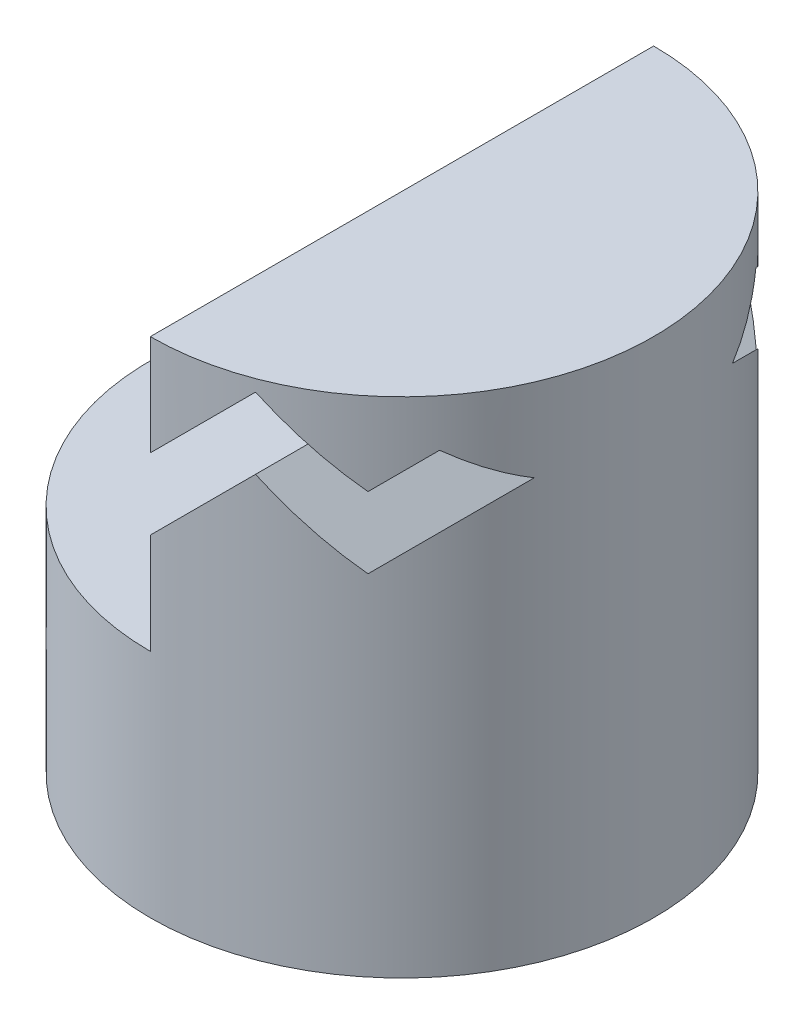
ISO-10303-21;
HEADER;
FILE_DESCRIPTION(('STEP AP214'),'2;1');
FILE_NAME('part.step','',(''),(''),'','','');
FILE_SCHEMA(('AUTOMOTIVE_DESIGN { 1 0 10303 214 1 1 1 1 }'));
ENDSEC;
DATA;
#1=APPLICATION_CONTEXT('core data for automotive mechanical design processes');
#2=APPLICATION_PROTOCOL_DEFINITION('international standard','automotive_design',2000,#1);
#3=PRODUCT_CONTEXT('',#1,'mechanical');
#4=PRODUCT('Part','Part','',(#3));
#5=PRODUCT_RELATED_PRODUCT_CATEGORY('part','',(#4));
#6=PRODUCT_DEFINITION_FORMATION('','',#4);
#7=PRODUCT_DEFINITION_CONTEXT('part definition',#1,'design');
#8=PRODUCT_DEFINITION('design','',#6,#7);
#9=PRODUCT_DEFINITION_SHAPE('','',#8);
#10=(LENGTH_UNIT() NAMED_UNIT(*) SI_UNIT(.MILLI.,.METRE.));
#11=(NAMED_UNIT(*) PLANE_ANGLE_UNIT() SI_UNIT($,.RADIAN.));
#12=(NAMED_UNIT(*) SI_UNIT($,.STERADIAN.) SOLID_ANGLE_UNIT());
#13=UNCERTAINTY_MEASURE_WITH_UNIT(LENGTH_MEASURE(1.E-05),#10,'distance_accuracy_value','');
#14=(GEOMETRIC_REPRESENTATION_CONTEXT(3) GLOBAL_UNCERTAINTY_ASSIGNED_CONTEXT((#13)) GLOBAL_UNIT_ASSIGNED_CONTEXT((#10,
#11,#12)) REPRESENTATION_CONTEXT('',''));
#15=CARTESIAN_POINT('',(0.,0.,0.));
#16=DIRECTION('',(0.,0.,1.));
#17=DIRECTION('',(1.,0.,0.));
#18=AXIS2_PLACEMENT_3D('',#15,#16,#17);
#19=CARTESIAN_POINT('',(0.,100.,0.));
#20=DIRECTION('',(0.,-1.,0.));
#21=DIRECTION('',(0.,0.,-1.));
#22=AXIS2_PLACEMENT_3D('',#19,#20,#21);
#23=CYLINDRICAL_SURFACE('',#22,50.);
#24=CARTESIAN_POINT('',(0.,0.,0.));
#25=DIRECTION('',(0.,1.,0.));
#26=DIRECTION('',(0.,0.,1.));
#27=AXIS2_PLACEMENT_3D('',#24,#25,#26);
#28=CIRCLE('',#27,50.);
#29=CARTESIAN_POINT('',(0.,0.,50.));
#30=VERTEX_POINT('',#29);
#31=EDGE_CURVE('E156',#30,#30,#28,.T.);
#32=ORIENTED_EDGE('',*,*,#31,.T.);
#33=EDGE_LOOP('',(#32));
#34=FACE_BOUND('',#33,.T.);
#35=DIRECTION('',(0.,1.,0.));
#36=VECTOR('',#35,1.);
#37=CARTESIAN_POINT('',(0.,65.857864376269,-50.));
#38=LINE('',#37,#36);
#39=CARTESIAN_POINT('',(0.,45.857864376269,-50.));
#40=VERTEX_POINT('',#39);
#41=CARTESIAN_POINT('',(0.,65.857864376269,-50.));
#42=VERTEX_POINT('',#41);
#43=EDGE_CURVE('E137',#40,#42,#38,.T.);
#44=ORIENTED_EDGE('',*,*,#43,.T.);
#45=CARTESIAN_POINT('',(0.,65.857864376269,0.));
#46=DIRECTION('',(0.707106781186552,-0.707106781186543,0.));
#47=DIRECTION('',(-0.707106781186543,-0.707106781186552,0.));
#48=AXIS2_PLACEMENT_3D('',#45,#46,#47);
#49=ELLIPSE('',#48,70.7106781186552,50.);
#50=CARTESIAN_POINT('',(17.6776695296638,83.535533905933,-46.7707173346742));
#51=VERTEX_POINT('',#50);
#52=EDGE_CURVE('E11',#42,#51,#49,.T.);
#53=ORIENTED_EDGE('',*,*,#52,.T.);
#54=CARTESIAN_POINT('',(0.,101.213203435597,0.));
#55=DIRECTION('',(-0.707106781186548,-0.707106781186547,0.));
#56=DIRECTION('',(0.707106781186547,-0.707106781186548,0.));
#57=AXIS2_PLACEMENT_3D('',#54,#55,#56);
#58=ELLIPSE('',#57,70.7106781186548,50.);
#59=CARTESIAN_POINT('',(31.8198051533948,69.3933982822019,-38.5681215513537));
#60=VERTEX_POINT('',#59);
#61=EDGE_CURVE('E48',#51,#60,#58,.T.);
#62=ORIENTED_EDGE('',*,*,#61,.T.);
#63=CARTESIAN_POINT('',(0.,37.5735931288072,0.));
#64=DIRECTION('',(0.707106781186547,-0.707106781186547,0.));
#65=DIRECTION('',(-0.707106781186548,-0.707106781186548,0.));
#66=AXIS2_PLACEMENT_3D('',#63,#64,#65);
#67=ELLIPSE('',#66,70.7106781186548,50.);
#68=CARTESIAN_POINT('',(45.9619407771258,83.5355339059329,-19.6850196850292));
#69=VERTEX_POINT('',#68);
#70=EDGE_CURVE('E211',#60,#69,#67,.T.);
#71=ORIENTED_EDGE('',*,*,#70,.T.);
#72=CARTESIAN_POINT('',(0.,129.497474683059,0.));
#73=DIRECTION('',(0.707106781186547,0.707106781186548,0.));
#74=DIRECTION('',(0.707106781186548,-0.707106781186547,0.));
#75=AXIS2_PLACEMENT_3D('',#72,#73,#74);
#76=ELLIPSE('',#75,70.7106781186547,50.);
#77=CARTESIAN_POINT('',(38.8908729652603,90.6066017177984,-31.4245127249411));
#78=VERTEX_POINT('',#77);
#79=EDGE_CURVE('E207',#69,#78,#76,.T.);
#80=ORIENTED_EDGE('',*,*,#79,.T.);
#81=CARTESIAN_POINT('',(0.,51.7157287525381,0.));
#82=DIRECTION('',(-0.707106781186547,0.707106781186548,0.));
#83=DIRECTION('',(-0.707106781186548,-0.707106781186547,0.));
#84=AXIS2_PLACEMENT_3D('',#81,#82,#83);
#85=ELLIPSE('',#84,70.7106781186547,50.);
#86=CARTESIAN_POINT('',(31.8198051533948,83.5355339059329,-38.5681215513537));
#87=VERTEX_POINT('',#86);
#88=EDGE_CURVE('E202',#78,#87,#85,.T.);
#89=ORIENTED_EDGE('',*,*,#88,.T.);
#90=CARTESIAN_POINT('',(0.,115.355339059328,0.));
#91=DIRECTION('',(0.707106781186547,0.707106781186548,0.));
#92=DIRECTION('',(0.707106781186548,-0.707106781186547,0.));
#93=AXIS2_PLACEMENT_3D('',#90,#91,#92);
#94=ELLIPSE('',#93,70.7106781186547,50.);
#95=CARTESIAN_POINT('',(17.6776695296638,97.6776695296638,-46.7707173346742));
#96=VERTEX_POINT('',#95);
#97=EDGE_CURVE('E197',#87,#96,#94,.T.);
#98=ORIENTED_EDGE('',*,*,#97,.T.);
#99=CARTESIAN_POINT('',(0.,80.,0.));
#100=DIRECTION('',(-0.707106781186547,0.707106781186548,0.));
#101=DIRECTION('',(-0.707106781186548,-0.707106781186547,0.));
#102=AXIS2_PLACEMENT_3D('',#99,#100,#101);
#103=ELLIPSE('',#102,70.7106781186547,50.);
#104=CARTESIAN_POINT('',(0.,80.,-50.));
#105=VERTEX_POINT('',#104);
#106=EDGE_CURVE('E193',#96,#105,#103,.T.);
#107=ORIENTED_EDGE('',*,*,#106,.T.);
#108=DIRECTION('',(0.,1.,0.));
#109=VECTOR('',#108,1.);
#110=CARTESIAN_POINT('',(0.,100.,-50.));
#111=LINE('',#110,#109);
#112=CARTESIAN_POINT('',(0.,100.,-50.));
#113=VERTEX_POINT('',#112);
#114=EDGE_CURVE('E140',#105,#113,#111,.T.);
#115=ORIENTED_EDGE('',*,*,#114,.T.);
#116=CARTESIAN_POINT('',(0.,100.,0.));
#117=DIRECTION('',(0.,1.,0.));
#118=DIRECTION('',(0.,0.,1.));
#119=AXIS2_PLACEMENT_3D('',#116,#117,#118);
#120=CIRCLE('',#119,50.);
#121=CARTESIAN_POINT('',(0.,100.,50.));
#122=VERTEX_POINT('',#121);
#123=EDGE_CURVE('E129',#122,#113,#120,.T.);
#124=ORIENTED_EDGE('',*,*,#123,.F.);
#125=DIRECTION('',(0.,1.,0.));
#126=VECTOR('',#125,1.);
#127=CARTESIAN_POINT('',(0.,100.,50.));
#128=LINE('',#127,#126);
#129=CARTESIAN_POINT('',(0.,80.,50.));
#130=VERTEX_POINT('',#129);
#131=EDGE_CURVE('E55',#130,#122,#128,.T.);
#132=ORIENTED_EDGE('',*,*,#131,.F.);
#133=CARTESIAN_POINT('',(17.6776695296638,97.6776695296638,46.7707173346742));
#134=VERTEX_POINT('',#133);
#135=EDGE_CURVE('E128',#130,#134,#103,.T.);
#136=ORIENTED_EDGE('',*,*,#135,.T.);
#137=CARTESIAN_POINT('',(31.8198051533948,83.5355339059329,38.5681215513536));
#138=VERTEX_POINT('',#137);
#139=EDGE_CURVE('E63',#134,#138,#94,.T.);
#140=ORIENTED_EDGE('',*,*,#139,.T.);
#141=CARTESIAN_POINT('',(38.8908729652603,90.6066017177984,31.4245127249411));
#142=VERTEX_POINT('',#141);
#143=EDGE_CURVE('E196',#138,#142,#85,.T.);
#144=ORIENTED_EDGE('',*,*,#143,.T.);
#145=CARTESIAN_POINT('',(45.9619407771258,83.5355339059329,19.6850196850291));
#146=VERTEX_POINT('',#145);
#147=EDGE_CURVE('E201',#142,#146,#76,.T.);
#148=ORIENTED_EDGE('',*,*,#147,.T.);
#149=CARTESIAN_POINT('',(31.8198051533948,69.3933982822019,38.5681215513537));
#150=VERTEX_POINT('',#149);
#151=EDGE_CURVE('E206',#146,#150,#67,.T.);
#152=ORIENTED_EDGE('',*,*,#151,.T.);
#153=CARTESIAN_POINT('',(17.6776695296638,83.535533905933,46.7707173346742));
#154=VERTEX_POINT('',#153);
#155=EDGE_CURVE('E210',#150,#154,#58,.T.);
#156=ORIENTED_EDGE('',*,*,#155,.T.);
#157=CARTESIAN_POINT('',(0.,65.857864376269,50.));
#158=VERTEX_POINT('',#157);
#159=EDGE_CURVE('E42',#154,#158,#49,.T.);
#160=ORIENTED_EDGE('',*,*,#159,.T.);
#161=DIRECTION('',(0.,1.,0.));
#162=VECTOR('',#161,1.);
#163=CARTESIAN_POINT('',(0.,65.857864376269,50.));
#164=LINE('',#163,#162);
#165=CARTESIAN_POINT('',(0.,45.857864376269,50.));
#166=VERTEX_POINT('',#165);
#167=EDGE_CURVE('E135',#166,#158,#164,.T.);
#168=ORIENTED_EDGE('',*,*,#167,.F.);
#169=CARTESIAN_POINT('',(0.,45.857864376269,0.));
#170=DIRECTION('',(0.,-1.,0.));
#171=DIRECTION('',(1.,0.,0.));
#172=AXIS2_PLACEMENT_3D('',#169,#170,#171);
#173=CIRCLE('',#172,50.);
#174=EDGE_CURVE('E119',#166,#40,#173,.T.);
#175=ORIENTED_EDGE('',*,*,#174,.T.);
#176=EDGE_LOOP('',(#44,#53,#62,#71,#80,#89,#98,#107,#115,#124,#132,#136,#140,#144,#148,#152,
#156,#160,#168,#175));
#177=FACE_BOUND('',#176,.T.);
#178=ADVANCED_FACE('F39',(#34,#177),#23,.T.);
#179=CARTESIAN_POINT('',(0.,100.,0.));
#180=DIRECTION('',(0.,1.,0.));
#181=DIRECTION('',(0.,0.,1.));
#182=AXIS2_PLACEMENT_3D('',#179,#180,#181);
#183=PLANE('',#182);
#184=DIRECTION('',(0.,0.,1.));
#185=VECTOR('',#184,1.);
#186=CARTESIAN_POINT('',(0.,100.,-50.));
#187=LINE('',#186,#185);
#188=EDGE_CURVE('E153',#113,#122,#187,.T.);
#189=ORIENTED_EDGE('',*,*,#188,.T.);
#190=ORIENTED_EDGE('',*,*,#123,.T.);
#191=EDGE_LOOP('',(#189,#190));
#192=FACE_BOUND('',#191,.T.);
#193=ADVANCED_FACE('F237',(#192),#183,.T.);
#194=CARTESIAN_POINT('',(0.,0.,0.));
#195=DIRECTION('',(0.,1.,0.));
#196=DIRECTION('',(0.,0.,1.));
#197=AXIS2_PLACEMENT_3D('',#194,#195,#196);
#198=PLANE('',#197);
#199=ORIENTED_EDGE('',*,*,#31,.F.);
#200=EDGE_LOOP('',(#199));
#201=FACE_BOUND('',#200,.T.);
#202=ADVANCED_FACE('F239',(#201),#198,.F.);
#203=CARTESIAN_POINT('',(0.,80.,-50.));
#204=DIRECTION('',(-0.707106781186547,0.707106781186548,0.));
#205=DIRECTION('',(-0.707106781186548,-0.707106781186547,0.));
#206=AXIS2_PLACEMENT_3D('',#203,#204,#205);
#207=PLANE('',#206);
#208=DIRECTION('',(0.,0.,1.));
#209=VECTOR('',#208,1.);
#210=CARTESIAN_POINT('',(0.,80.,-50.));
#211=LINE('',#210,#209);
#212=EDGE_CURVE('E157',#105,#130,#211,.T.);
#213=ORIENTED_EDGE('',*,*,#212,.F.);
#214=ORIENTED_EDGE('',*,*,#106,.F.);
#215=DIRECTION('',(0.,0.,1.));
#216=VECTOR('',#215,1.);
#217=CARTESIAN_POINT('',(17.6776695296638,97.6776695296638,-50.));
#218=LINE('',#217,#216);
#219=EDGE_CURVE('E160',#96,#134,#218,.T.);
#220=ORIENTED_EDGE('',*,*,#219,.T.);
#221=ORIENTED_EDGE('',*,*,#135,.F.);
#222=EDGE_LOOP('',(#213,#214,#220,#221));
#223=FACE_BOUND('',#222,.T.);
#224=ADVANCED_FACE('F229',(#223),#207,.F.);
#225=CARTESIAN_POINT('',(31.8198051533948,83.5355339059329,-50.));
#226=DIRECTION('',(0.707106781186547,0.707106781186548,0.));
#227=DIRECTION('',(-0.707106781186548,0.707106781186547,0.));
#228=AXIS2_PLACEMENT_3D('',#225,#226,#227);
#229=PLANE('',#228);
#230=DIRECTION('',(0.,0.,1.));
#231=VECTOR('',#230,1.);
#232=CARTESIAN_POINT('',(31.8198051533948,83.5355339059329,-50.));
#233=LINE('',#232,#231);
#234=EDGE_CURVE('E163',#87,#138,#233,.T.);
#235=ORIENTED_EDGE('',*,*,#234,.T.);
#236=ORIENTED_EDGE('',*,*,#139,.F.);
#237=ORIENTED_EDGE('',*,*,#219,.F.);
#238=ORIENTED_EDGE('',*,*,#97,.F.);
#239=EDGE_LOOP('',(#235,#236,#237,#238));
#240=FACE_BOUND('',#239,.T.);
#241=ADVANCED_FACE('F230',(#240),#229,.F.);
#242=CARTESIAN_POINT('',(38.8908729652603,90.6066017177984,-50.));
#243=DIRECTION('',(-0.707106781186547,0.707106781186548,0.));
#244=DIRECTION('',(-0.707106781186548,-0.707106781186547,0.));
#245=AXIS2_PLACEMENT_3D('',#242,#243,#244);
#246=PLANE('',#245);
#247=ORIENTED_EDGE('',*,*,#234,.F.);
#248=ORIENTED_EDGE('',*,*,#88,.F.);
#249=DIRECTION('',(0.,0.,1.));
#250=VECTOR('',#249,1.);
#251=CARTESIAN_POINT('',(38.8908729652603,90.6066017177984,-50.));
#252=LINE('',#251,#250);
#253=EDGE_CURVE('E166',#78,#142,#252,.T.);
#254=ORIENTED_EDGE('',*,*,#253,.T.);
#255=ORIENTED_EDGE('',*,*,#143,.F.);
#256=EDGE_LOOP('',(#247,#248,#254,#255));
#257=FACE_BOUND('',#256,.T.);
#258=ADVANCED_FACE('F233',(#257),#246,.F.);
#259=CARTESIAN_POINT('',(45.9619407771258,83.5355339059329,-50.));
#260=DIRECTION('',(0.707106781186547,0.707106781186548,0.));
#261=DIRECTION('',(-0.707106781186548,0.707106781186547,0.));
#262=AXIS2_PLACEMENT_3D('',#259,#260,#261);
#263=PLANE('',#262);
#264=DIRECTION('',(0.,0.,1.));
#265=VECTOR('',#264,1.);
#266=CARTESIAN_POINT('',(45.9619407771258,83.5355339059329,-50.));
#267=LINE('',#266,#265);
#268=EDGE_CURVE('E170',#69,#146,#267,.T.);
#269=ORIENTED_EDGE('',*,*,#268,.T.);
#270=ORIENTED_EDGE('',*,*,#147,.F.);
#271=ORIENTED_EDGE('',*,*,#253,.F.);
#272=ORIENTED_EDGE('',*,*,#79,.F.);
#273=EDGE_LOOP('',(#269,#270,#271,#272));
#274=FACE_BOUND('',#273,.T.);
#275=ADVANCED_FACE('F263',(#274),#263,.F.);
#276=CARTESIAN_POINT('',(31.8198051533948,69.3933982822019,-50.));
#277=DIRECTION('',(0.707106781186547,-0.707106781186547,0.));
#278=DIRECTION('',(0.707106781186548,0.707106781186548,0.));
#279=AXIS2_PLACEMENT_3D('',#276,#277,#278);
#280=PLANE('',#279);
#281=DIRECTION('',(0.,0.,1.));
#282=VECTOR('',#281,1.);
#283=CARTESIAN_POINT('',(31.8198051533948,69.3933982822019,-50.));
#284=LINE('',#283,#282);
#285=EDGE_CURVE('E174',#60,#150,#284,.T.);
#286=ORIENTED_EDGE('',*,*,#285,.T.);
#287=ORIENTED_EDGE('',*,*,#151,.F.);
#288=ORIENTED_EDGE('',*,*,#268,.F.);
#289=ORIENTED_EDGE('',*,*,#70,.F.);
#290=EDGE_LOOP('',(#286,#287,#288,#289));
#291=FACE_BOUND('',#290,.T.);
#292=ADVANCED_FACE('F259',(#291),#280,.F.);
#293=CARTESIAN_POINT('',(17.6776695296638,83.535533905933,-50.));
#294=DIRECTION('',(-0.707106781186548,-0.707106781186547,0.));
#295=DIRECTION('',(0.707106781186547,-0.707106781186548,0.));
#296=AXIS2_PLACEMENT_3D('',#293,#294,#295);
#297=PLANE('',#296);
#298=ORIENTED_EDGE('',*,*,#285,.F.);
#299=ORIENTED_EDGE('',*,*,#61,.F.);
#300=DIRECTION('',(0.,0.,1.));
#301=VECTOR('',#300,1.);
#302=CARTESIAN_POINT('',(17.6776695296638,83.535533905933,-50.));
#303=LINE('',#302,#301);
#304=EDGE_CURVE('E178',#51,#154,#303,.T.);
#305=ORIENTED_EDGE('',*,*,#304,.T.);
#306=ORIENTED_EDGE('',*,*,#155,.F.);
#307=EDGE_LOOP('',(#298,#299,#305,#306));
#308=FACE_BOUND('',#307,.T.);
#309=ADVANCED_FACE('F255',(#308),#297,.F.);
#310=CARTESIAN_POINT('',(17.6776695296638,83.535533905933,-50.));
#311=DIRECTION('',(0.707106781186552,-0.707106781186543,0.));
#312=DIRECTION('',(0.707106781186543,0.707106781186552,0.));
#313=AXIS2_PLACEMENT_3D('',#310,#311,#312);
#314=PLANE('',#313);
#315=DIRECTION('',(0.,0.,1.));
#316=VECTOR('',#315,1.);
#317=CARTESIAN_POINT('',(0.,65.857864376269,-50.));
#318=LINE('',#317,#316);
#319=EDGE_CURVE('E139',#42,#158,#318,.T.);
#320=ORIENTED_EDGE('',*,*,#319,.T.);
#321=ORIENTED_EDGE('',*,*,#159,.F.);
#322=ORIENTED_EDGE('',*,*,#304,.F.);
#323=ORIENTED_EDGE('',*,*,#52,.F.);
#324=EDGE_LOOP('',(#320,#321,#322,#323));
#325=FACE_BOUND('',#324,.T.);
#326=ADVANCED_FACE('F250',(#325),#314,.F.);
#327=CARTESIAN_POINT('',(0.,45.857864376269,-50.));
#328=DIRECTION('',(0.,-1.,0.));
#329=DIRECTION('',(1.,0.,0.));
#330=AXIS2_PLACEMENT_3D('',#327,#328,#329);
#331=PLANE('',#330);
#332=DIRECTION('',(0.,0.,1.));
#333=VECTOR('',#332,1.);
#334=CARTESIAN_POINT('',(0.,45.857864376269,-50.));
#335=LINE('',#334,#333);
#336=EDGE_CURVE('E122',#40,#166,#335,.T.);
#337=ORIENTED_EDGE('',*,*,#336,.F.);
#338=ORIENTED_EDGE('',*,*,#174,.F.);
#339=EDGE_LOOP('',(#337,#338));
#340=FACE_BOUND('',#339,.T.);
#341=ADVANCED_FACE('F121',(#340),#331,.F.);
#342=CARTESIAN_POINT('',(0.,100.,-50.));
#343=DIRECTION('',(1.,0.,0.));
#344=DIRECTION('',(0.,1.,0.));
#345=AXIS2_PLACEMENT_3D('',#342,#343,#344);
#346=PLANE('',#345);
#347=ORIENTED_EDGE('',*,*,#188,.F.);
#348=ORIENTED_EDGE('',*,*,#114,.F.);
#349=ORIENTED_EDGE('',*,*,#212,.T.);
#350=ORIENTED_EDGE('',*,*,#131,.T.);
#351=EDGE_LOOP('',(#347,#348,#349,#350));
#352=FACE_BOUND('',#351,.T.);
#353=ADVANCED_FACE('F235',(#352),#346,.F.);
#354=CARTESIAN_POINT('',(0.,65.857864376269,-50.));
#355=DIRECTION('',(1.,0.,0.));
#356=DIRECTION('',(0.,1.,0.));
#357=AXIS2_PLACEMENT_3D('',#354,#355,#356);
#358=PLANE('',#357);
#359=ORIENTED_EDGE('',*,*,#319,.F.);
#360=ORIENTED_EDGE('',*,*,#43,.F.);
#361=ORIENTED_EDGE('',*,*,#336,.T.);
#362=ORIENTED_EDGE('',*,*,#167,.T.);
#363=EDGE_LOOP('',(#359,#360,#361,#362));
#364=FACE_BOUND('',#363,.T.);
#365=ADVANCED_FACE('F134',(#364),#358,.F.);
#366=CLOSED_SHELL('',(#178,#193,#202,#224,#241,#258,#275,#292,#309,#326,#341,#353,#365));
#367=MANIFOLD_SOLID_BREP('B2',#366);
#368=ADVANCED_BREP_SHAPE_REPRESENTATION('',(#18,#367),#14);
#369=SHAPE_DEFINITION_REPRESENTATION(#9,#368);
ENDSEC;
END-ISO-10303-21;
